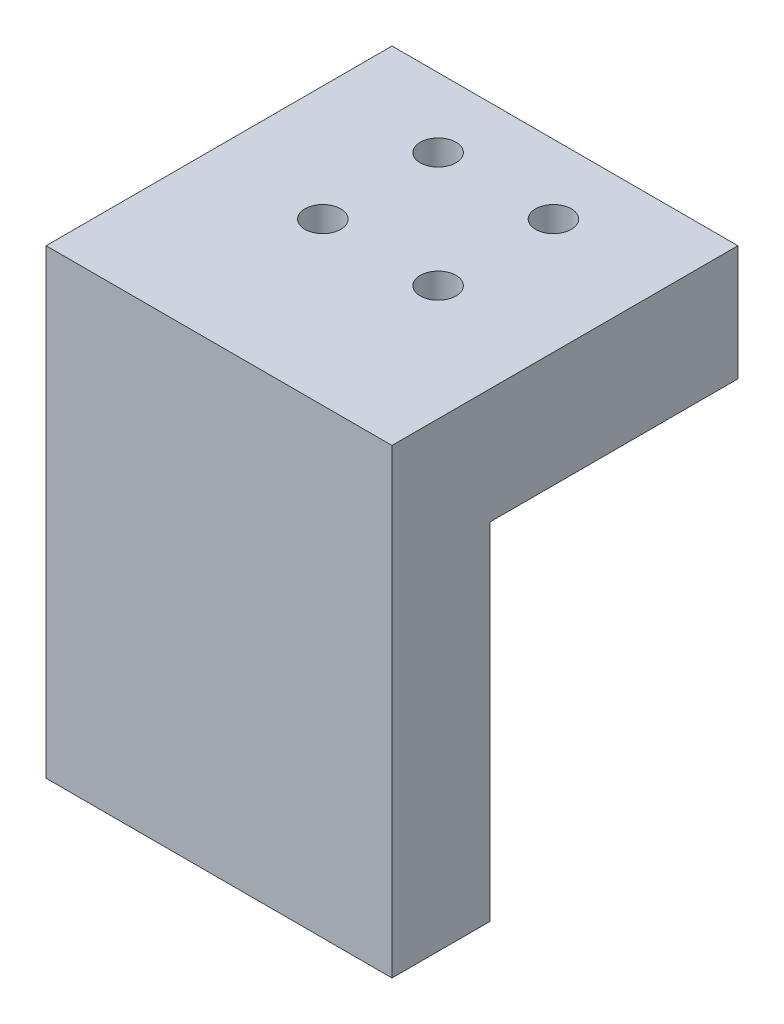
ISO-10303-21;
HEADER;
FILE_DESCRIPTION(('STEP AP214'),'2;1');
FILE_NAME('part.step','',(''),(''),'','','');
FILE_SCHEMA(('AUTOMOTIVE_DESIGN { 1 0 10303 214 1 1 1 1 }'));
ENDSEC;
DATA;
#1=APPLICATION_CONTEXT('core data for automotive mechanical design processes');
#2=APPLICATION_PROTOCOL_DEFINITION('international standard','automotive_design',2000,#1);
#3=PRODUCT_CONTEXT('',#1,'mechanical');
#4=PRODUCT('Part','Part','',(#3));
#5=PRODUCT_RELATED_PRODUCT_CATEGORY('part','',(#4));
#6=PRODUCT_DEFINITION_FORMATION('','',#4);
#7=PRODUCT_DEFINITION_CONTEXT('part definition',#1,'design');
#8=PRODUCT_DEFINITION('design','',#6,#7);
#9=PRODUCT_DEFINITION_SHAPE('','',#8);
#10=(LENGTH_UNIT() NAMED_UNIT(*) SI_UNIT(.MILLI.,.METRE.));
#11=(NAMED_UNIT(*) PLANE_ANGLE_UNIT() SI_UNIT($,.RADIAN.));
#12=(NAMED_UNIT(*) SI_UNIT($,.STERADIAN.) SOLID_ANGLE_UNIT());
#13=UNCERTAINTY_MEASURE_WITH_UNIT(LENGTH_MEASURE(1.E-05),#10,'distance_accuracy_value','');
#14=(GEOMETRIC_REPRESENTATION_CONTEXT(3) GLOBAL_UNCERTAINTY_ASSIGNED_CONTEXT((#13)) GLOBAL_UNIT_ASSIGNED_CONTEXT((#10,
#11,#12)) REPRESENTATION_CONTEXT('',''));
#15=CARTESIAN_POINT('',(0.,0.,0.));
#16=DIRECTION('',(0.,0.,1.));
#17=DIRECTION('',(1.,0.,0.));
#18=AXIS2_PLACEMENT_3D('',#15,#16,#17);
#19=CARTESIAN_POINT('',(5.,30.,1.));
#20=DIRECTION('',(0.,-1.,0.));
#21=DIRECTION('',(0.,0.,-1.));
#22=AXIS2_PLACEMENT_3D('',#19,#20,#21);
#23=CYLINDRICAL_SURFACE('',#22,1.55);
#24=CARTESIAN_POINT('',(5.,10.,1.));
#25=DIRECTION('',(0.,-1.,0.));
#26=DIRECTION('',(0.,0.,-1.));
#27=AXIS2_PLACEMENT_3D('',#24,#25,#26);
#28=CIRCLE('',#27,1.55);
#29=CARTESIAN_POINT('',(5.,10.,-0.55));
#30=VERTEX_POINT('',#29);
#31=EDGE_CURVE('E294',#30,#30,#28,.T.);
#32=ORIENTED_EDGE('',*,*,#31,.F.);
#33=EDGE_LOOP('',(#32));
#34=FACE_BOUND('',#33,.T.);
#35=CARTESIAN_POINT('',(5.,3.,1.));
#36=DIRECTION('',(0.,-1.,0.));
#37=DIRECTION('',(0.,0.,-1.));
#38=AXIS2_PLACEMENT_3D('',#35,#36,#37);
#39=CIRCLE('',#38,1.55);
#40=CARTESIAN_POINT('',(5.,3.,-0.55));
#41=VERTEX_POINT('',#40);
#42=EDGE_CURVE('E260',#41,#41,#39,.F.);
#43=ORIENTED_EDGE('',*,*,#42,.F.);
#44=EDGE_LOOP('',(#43));
#45=FACE_BOUND('',#44,.T.);
#46=ADVANCED_FACE('F47',(#34,#45),#23,.F.);
#47=CARTESIAN_POINT('',(-5.,30.,-9.));
#48=DIRECTION('',(0.,-1.,0.));
#49=DIRECTION('',(0.,0.,-1.));
#50=AXIS2_PLACEMENT_3D('',#47,#48,#49);
#51=CYLINDRICAL_SURFACE('',#50,1.55);
#52=CARTESIAN_POINT('',(-5.,10.,-9.));
#53=DIRECTION('',(0.,-1.,0.));
#54=DIRECTION('',(0.,0.,-1.));
#55=AXIS2_PLACEMENT_3D('',#52,#53,#54);
#56=CIRCLE('',#55,1.55);
#57=CARTESIAN_POINT('',(-5.,10.,-10.55));
#58=VERTEX_POINT('',#57);
#59=EDGE_CURVE('E298',#58,#58,#56,.T.);
#60=ORIENTED_EDGE('',*,*,#59,.F.);
#61=EDGE_LOOP('',(#60));
#62=FACE_BOUND('',#61,.T.);
#63=CARTESIAN_POINT('',(-5.,3.,-9.));
#64=DIRECTION('',(0.,-1.,0.));
#65=DIRECTION('',(0.,0.,-1.));
#66=AXIS2_PLACEMENT_3D('',#63,#64,#65);
#67=CIRCLE('',#66,1.55);
#68=CARTESIAN_POINT('',(-5.,3.,-10.55));
#69=VERTEX_POINT('',#68);
#70=EDGE_CURVE('E271',#69,#69,#67,.F.);
#71=ORIENTED_EDGE('',*,*,#70,.F.);
#72=EDGE_LOOP('',(#71));
#73=FACE_BOUND('',#72,.T.);
#74=ADVANCED_FACE('F194',(#62,#73),#51,.F.);
#75=CARTESIAN_POINT('',(-5.,30.,1.));
#76=DIRECTION('',(0.,-1.,0.));
#77=DIRECTION('',(0.,0.,-1.));
#78=AXIS2_PLACEMENT_3D('',#75,#76,#77);
#79=CYLINDRICAL_SURFACE('',#78,1.55);
#80=CARTESIAN_POINT('',(-5.,10.,1.));
#81=DIRECTION('',(0.,-1.,0.));
#82=DIRECTION('',(0.,0.,-1.));
#83=AXIS2_PLACEMENT_3D('',#80,#81,#82);
#84=CIRCLE('',#83,1.55);
#85=CARTESIAN_POINT('',(-5.,10.,-0.55));
#86=VERTEX_POINT('',#85);
#87=EDGE_CURVE('E301',#86,#86,#84,.T.);
#88=ORIENTED_EDGE('',*,*,#87,.F.);
#89=EDGE_LOOP('',(#88));
#90=FACE_BOUND('',#89,.T.);
#91=CARTESIAN_POINT('',(-5.,3.,1.));
#92=DIRECTION('',(0.,-1.,0.));
#93=DIRECTION('',(0.,0.,-1.));
#94=AXIS2_PLACEMENT_3D('',#91,#92,#93);
#95=CIRCLE('',#94,1.55);
#96=CARTESIAN_POINT('',(-5.,3.,-0.55));
#97=VERTEX_POINT('',#96);
#98=EDGE_CURVE('E51',#97,#97,#95,.F.);
#99=ORIENTED_EDGE('',*,*,#98,.F.);
#100=EDGE_LOOP('',(#99));
#101=FACE_BOUND('',#100,.T.);
#102=ADVANCED_FACE('F200',(#90,#101),#79,.F.);
#103=CARTESIAN_POINT('',(5.,30.,-9.));
#104=DIRECTION('',(0.,-1.,0.));
#105=DIRECTION('',(0.,0.,-1.));
#106=AXIS2_PLACEMENT_3D('',#103,#104,#105);
#107=CYLINDRICAL_SURFACE('',#106,1.55);
#108=CARTESIAN_POINT('',(5.,10.,-9.));
#109=DIRECTION('',(0.,-1.,0.));
#110=DIRECTION('',(0.,0.,-1.));
#111=AXIS2_PLACEMENT_3D('',#108,#109,#110);
#112=CIRCLE('',#111,1.55);
#113=CARTESIAN_POINT('',(5.,10.,-10.55));
#114=VERTEX_POINT('',#113);
#115=EDGE_CURVE('E137',#114,#114,#112,.T.);
#116=ORIENTED_EDGE('',*,*,#115,.F.);
#117=EDGE_LOOP('',(#116));
#118=FACE_BOUND('',#117,.T.);
#119=CARTESIAN_POINT('',(5.,3.,-9.));
#120=DIRECTION('',(0.,-1.,0.));
#121=DIRECTION('',(0.,0.,-1.));
#122=AXIS2_PLACEMENT_3D('',#119,#120,#121);
#123=CIRCLE('',#122,1.55);
#124=CARTESIAN_POINT('',(5.,3.,-10.55));
#125=VERTEX_POINT('',#124);
#126=EDGE_CURVE('E255',#125,#125,#123,.F.);
#127=ORIENTED_EDGE('',*,*,#126,.F.);
#128=EDGE_LOOP('',(#127));
#129=FACE_BOUND('',#128,.T.);
#130=ADVANCED_FACE('F208',(#118,#129),#107,.F.);
#131=CARTESIAN_POINT('',(15.,10.,15.));
#132=DIRECTION('',(-1.,0.,0.));
#133=DIRECTION('',(0.,0.,1.));
#134=AXIS2_PLACEMENT_3D('',#131,#132,#133);
#135=PLANE('',#134);
#136=DIRECTION('',(0.,-1.,0.));
#137=VECTOR('',#136,1.);
#138=CARTESIAN_POINT('',(15.,10.,15.));
#139=LINE('',#138,#137);
#140=CARTESIAN_POINT('',(15.,10.,15.));
#141=VERTEX_POINT('',#140);
#142=CARTESIAN_POINT('',(15.,-30.,15.));
#143=VERTEX_POINT('',#142);
#144=EDGE_CURVE('E110',#141,#143,#139,.T.);
#145=ORIENTED_EDGE('',*,*,#144,.T.);
#146=DIRECTION('',(0.,0.,1.));
#147=VECTOR('',#146,1.);
#148=CARTESIAN_POINT('',(15.,-30.,0.));
#149=LINE('',#148,#147);
#150=CARTESIAN_POINT('',(15.,-30.,6.5));
#151=VERTEX_POINT('',#150);
#152=EDGE_CURVE('E114',#151,#143,#149,.T.);
#153=ORIENTED_EDGE('',*,*,#152,.F.);
#154=DIRECTION('',(0.,1.,0.));
#155=VECTOR('',#154,1.);
#156=CARTESIAN_POINT('',(15.,-30.,6.5));
#157=LINE('',#156,#155);
#158=CARTESIAN_POINT('',(15.,0.,6.5));
#159=VERTEX_POINT('',#158);
#160=EDGE_CURVE('E145',#151,#159,#157,.T.);
#161=ORIENTED_EDGE('',*,*,#160,.T.);
#162=DIRECTION('',(0.,0.,-1.));
#163=VECTOR('',#162,1.);
#164=CARTESIAN_POINT('',(15.,0.,15.));
#165=LINE('',#164,#163);
#166=CARTESIAN_POINT('',(15.,0.,-15.));
#167=VERTEX_POINT('',#166);
#168=EDGE_CURVE('E153',#159,#167,#165,.T.);
#169=ORIENTED_EDGE('',*,*,#168,.T.);
#170=DIRECTION('',(0.,-1.,0.));
#171=VECTOR('',#170,1.);
#172=CARTESIAN_POINT('',(15.,10.,-15.));
#173=LINE('',#172,#171);
#174=CARTESIAN_POINT('',(15.,10.,-15.));
#175=VERTEX_POINT('',#174);
#176=EDGE_CURVE('E12',#175,#167,#173,.T.);
#177=ORIENTED_EDGE('',*,*,#176,.F.);
#178=DIRECTION('',(0.,0.,-1.));
#179=VECTOR('',#178,1.);
#180=CARTESIAN_POINT('',(15.,10.,15.));
#181=LINE('',#180,#179);
#182=EDGE_CURVE('E116',#141,#175,#181,.T.);
#183=ORIENTED_EDGE('',*,*,#182,.F.);
#184=EDGE_LOOP('',(#145,#153,#161,#169,#177,#183));
#185=FACE_BOUND('',#184,.T.);
#186=ADVANCED_FACE('F49',(#185),#135,.F.);
#187=CARTESIAN_POINT('',(-15.,10.,-15.));
#188=DIRECTION('',(0.,0.,1.));
#189=DIRECTION('',(1.,0.,0.));
#190=AXIS2_PLACEMENT_3D('',#187,#188,#189);
#191=PLANE('',#190);
#192=DIRECTION('',(-1.,0.,0.));
#193=VECTOR('',#192,1.);
#194=CARTESIAN_POINT('',(-15.,0.,-15.));
#195=LINE('',#194,#193);
#196=CARTESIAN_POINT('',(-15.,0.,-15.));
#197=VERTEX_POINT('',#196);
#198=EDGE_CURVE('E88',#167,#197,#195,.T.);
#199=ORIENTED_EDGE('',*,*,#198,.T.);
#200=DIRECTION('',(0.,-1.,0.));
#201=VECTOR('',#200,1.);
#202=CARTESIAN_POINT('',(-15.,10.,-15.));
#203=LINE('',#202,#201);
#204=CARTESIAN_POINT('',(-15.,10.,-15.));
#205=VERTEX_POINT('',#204);
#206=EDGE_CURVE('E57',#205,#197,#203,.T.);
#207=ORIENTED_EDGE('',*,*,#206,.F.);
#208=DIRECTION('',(-1.,0.,0.));
#209=VECTOR('',#208,1.);
#210=CARTESIAN_POINT('',(-15.,10.,-15.));
#211=LINE('',#210,#209);
#212=EDGE_CURVE('E93',#175,#205,#211,.T.);
#213=ORIENTED_EDGE('',*,*,#212,.F.);
#214=ORIENTED_EDGE('',*,*,#176,.T.);
#215=EDGE_LOOP('',(#199,#207,#213,#214));
#216=FACE_BOUND('',#215,.T.);
#217=ADVANCED_FACE('F178',(#216),#191,.F.);
#218=CARTESIAN_POINT('',(-15.,10.,15.));
#219=DIRECTION('',(1.,0.,0.));
#220=DIRECTION('',(0.,0.,-1.));
#221=AXIS2_PLACEMENT_3D('',#218,#219,#220);
#222=PLANE('',#221);
#223=DIRECTION('',(0.,0.,1.));
#224=VECTOR('',#223,1.);
#225=CARTESIAN_POINT('',(-15.,0.,15.));
#226=LINE('',#225,#224);
#227=CARTESIAN_POINT('',(-15.,0.,6.5));
#228=VERTEX_POINT('',#227);
#229=EDGE_CURVE('E156',#197,#228,#226,.T.);
#230=ORIENTED_EDGE('',*,*,#229,.T.);
#231=DIRECTION('',(0.,1.,0.));
#232=VECTOR('',#231,1.);
#233=CARTESIAN_POINT('',(-15.,-30.,6.5));
#234=LINE('',#233,#232);
#235=CARTESIAN_POINT('',(-15.,-30.,6.5));
#236=VERTEX_POINT('',#235);
#237=EDGE_CURVE('E149',#236,#228,#234,.T.);
#238=ORIENTED_EDGE('',*,*,#237,.F.);
#239=DIRECTION('',(0.,0.,-1.));
#240=VECTOR('',#239,1.);
#241=CARTESIAN_POINT('',(-15.,-30.,0.));
#242=LINE('',#241,#240);
#243=CARTESIAN_POINT('',(-15.,-30.,15.));
#244=VERTEX_POINT('',#243);
#245=EDGE_CURVE('E128',#244,#236,#242,.T.);
#246=ORIENTED_EDGE('',*,*,#245,.F.);
#247=DIRECTION('',(0.,-1.,0.));
#248=VECTOR('',#247,1.);
#249=CARTESIAN_POINT('',(-15.,10.,15.));
#250=LINE('',#249,#248);
#251=CARTESIAN_POINT('',(-15.,10.,15.));
#252=VERTEX_POINT('',#251);
#253=EDGE_CURVE('E119',#252,#244,#250,.T.);
#254=ORIENTED_EDGE('',*,*,#253,.F.);
#255=DIRECTION('',(0.,0.,1.));
#256=VECTOR('',#255,1.);
#257=CARTESIAN_POINT('',(-15.,10.,15.));
#258=LINE('',#257,#256);
#259=EDGE_CURVE('E159',#205,#252,#258,.T.);
#260=ORIENTED_EDGE('',*,*,#259,.F.);
#261=ORIENTED_EDGE('',*,*,#206,.T.);
#262=EDGE_LOOP('',(#230,#238,#246,#254,#260,#261));
#263=FACE_BOUND('',#262,.T.);
#264=ADVANCED_FACE('F175',(#263),#222,.F.);
#265=CARTESIAN_POINT('',(-15.,10.,15.));
#266=DIRECTION('',(0.,0.,-1.));
#267=DIRECTION('',(-1.,0.,0.));
#268=AXIS2_PLACEMENT_3D('',#265,#266,#267);
#269=PLANE('',#268);
#270=ORIENTED_EDGE('',*,*,#253,.T.);
#271=DIRECTION('',(-1.,0.,0.));
#272=VECTOR('',#271,1.);
#273=CARTESIAN_POINT('',(0.,-30.,15.));
#274=LINE('',#273,#272);
#275=EDGE_CURVE('E122',#143,#244,#274,.T.);
#276=ORIENTED_EDGE('',*,*,#275,.F.);
#277=ORIENTED_EDGE('',*,*,#144,.F.);
#278=DIRECTION('',(1.,0.,0.));
#279=VECTOR('',#278,1.);
#280=CARTESIAN_POINT('',(-15.,10.,15.));
#281=LINE('',#280,#279);
#282=EDGE_CURVE('E73',#252,#141,#281,.T.);
#283=ORIENTED_EDGE('',*,*,#282,.F.);
#284=EDGE_LOOP('',(#270,#276,#277,#283));
#285=FACE_BOUND('',#284,.T.);
#286=ADVANCED_FACE('F123',(#285),#269,.F.);
#287=CARTESIAN_POINT('',(0.,10.,0.));
#288=DIRECTION('',(0.,-1.,0.));
#289=DIRECTION('',(0.,0.,-1.));
#290=AXIS2_PLACEMENT_3D('',#287,#288,#289);
#291=PLANE('',#290);
#292=ORIENTED_EDGE('',*,*,#115,.T.);
#293=EDGE_LOOP('',(#292));
#294=FACE_BOUND('',#293,.T.);
#295=ORIENTED_EDGE('',*,*,#87,.T.);
#296=EDGE_LOOP('',(#295));
#297=FACE_BOUND('',#296,.T.);
#298=ORIENTED_EDGE('',*,*,#59,.T.);
#299=EDGE_LOOP('',(#298));
#300=FACE_BOUND('',#299,.T.);
#301=ORIENTED_EDGE('',*,*,#31,.T.);
#302=EDGE_LOOP('',(#301));
#303=FACE_BOUND('',#302,.T.);
#304=ORIENTED_EDGE('',*,*,#182,.T.);
#305=ORIENTED_EDGE('',*,*,#212,.T.);
#306=ORIENTED_EDGE('',*,*,#259,.T.);
#307=ORIENTED_EDGE('',*,*,#282,.T.);
#308=EDGE_LOOP('',(#304,#305,#306,#307));
#309=FACE_BOUND('',#308,.T.);
#310=ADVANCED_FACE('F189',(#294,#297,#300,#303,#309),#291,.F.);
#311=CARTESIAN_POINT('',(0.,0.,0.));
#312=DIRECTION('',(0.,-1.,0.));
#313=DIRECTION('',(0.,0.,-1.));
#314=AXIS2_PLACEMENT_3D('',#311,#312,#313);
#315=PLANE('',#314);
#316=CARTESIAN_POINT('',(-5.,0.,1.));
#317=DIRECTION('',(0.,-1.,0.));
#318=DIRECTION('',(0.,0.,-1.));
#319=AXIS2_PLACEMENT_3D('',#316,#317,#318);
#320=CIRCLE('',#319,3.5);
#321=CARTESIAN_POINT('',(-5.,0.,-2.5));
#322=VERTEX_POINT('',#321);
#323=EDGE_CURVE('E276',#322,#322,#320,.T.);
#324=ORIENTED_EDGE('',*,*,#323,.F.);
#325=EDGE_LOOP('',(#324));
#326=FACE_BOUND('',#325,.T.);
#327=CARTESIAN_POINT('',(-5.,0.,-9.));
#328=DIRECTION('',(0.,-1.,0.));
#329=DIRECTION('',(0.,0.,-1.));
#330=AXIS2_PLACEMENT_3D('',#327,#328,#329);
#331=CIRCLE('',#330,3.5);
#332=CARTESIAN_POINT('',(-5.,0.,-12.5));
#333=VERTEX_POINT('',#332);
#334=EDGE_CURVE('E266',#333,#333,#331,.T.);
#335=ORIENTED_EDGE('',*,*,#334,.F.);
#336=EDGE_LOOP('',(#335));
#337=FACE_BOUND('',#336,.T.);
#338=CARTESIAN_POINT('',(5.,0.,-9.));
#339=DIRECTION('',(0.,-1.,0.));
#340=DIRECTION('',(0.,0.,-1.));
#341=AXIS2_PLACEMENT_3D('',#338,#339,#340);
#342=CIRCLE('',#341,3.5);
#343=CARTESIAN_POINT('',(5.,0.,-12.5));
#344=VERTEX_POINT('',#343);
#345=EDGE_CURVE('E251',#344,#344,#342,.T.);
#346=ORIENTED_EDGE('',*,*,#345,.F.);
#347=EDGE_LOOP('',(#346));
#348=FACE_BOUND('',#347,.T.);
#349=CARTESIAN_POINT('',(5.,0.,1.));
#350=DIRECTION('',(0.,-1.,0.));
#351=DIRECTION('',(0.,0.,-1.));
#352=AXIS2_PLACEMENT_3D('',#349,#350,#351);
#353=CIRCLE('',#352,3.5);
#354=CARTESIAN_POINT('',(5.,0.,-2.5));
#355=VERTEX_POINT('',#354);
#356=EDGE_CURVE('E254',#355,#355,#353,.T.);
#357=ORIENTED_EDGE('',*,*,#356,.F.);
#358=EDGE_LOOP('',(#357));
#359=FACE_BOUND('',#358,.T.);
#360=DIRECTION('',(1.,0.,0.));
#361=VECTOR('',#360,1.);
#362=CARTESIAN_POINT('',(0.,0.,6.5));
#363=LINE('',#362,#361);
#364=EDGE_CURVE('E64',#228,#159,#363,.T.);
#365=ORIENTED_EDGE('',*,*,#364,.F.);
#366=ORIENTED_EDGE('',*,*,#229,.F.);
#367=ORIENTED_EDGE('',*,*,#198,.F.);
#368=ORIENTED_EDGE('',*,*,#168,.F.);
#369=EDGE_LOOP('',(#365,#366,#367,#368));
#370=FACE_BOUND('',#369,.T.);
#371=ADVANCED_FACE('F177',(#326,#337,#348,#359,#370),#315,.T.);
#372=CARTESIAN_POINT('',(0.,-30.,6.5));
#373=DIRECTION('',(0.,0.,1.));
#374=DIRECTION('',(1.,0.,0.));
#375=AXIS2_PLACEMENT_3D('',#372,#373,#374);
#376=PLANE('',#375);
#377=ORIENTED_EDGE('',*,*,#364,.T.);
#378=ORIENTED_EDGE('',*,*,#160,.F.);
#379=DIRECTION('',(1.,0.,0.));
#380=VECTOR('',#379,1.);
#381=CARTESIAN_POINT('',(0.,-30.,6.5));
#382=LINE('',#381,#380);
#383=EDGE_CURVE('E132',#236,#151,#382,.T.);
#384=ORIENTED_EDGE('',*,*,#383,.F.);
#385=ORIENTED_EDGE('',*,*,#237,.T.);
#386=EDGE_LOOP('',(#377,#378,#384,#385));
#387=FACE_BOUND('',#386,.T.);
#388=ADVANCED_FACE('F180',(#387),#376,.F.);
#389=CARTESIAN_POINT('',(0.,-30.,0.));
#390=DIRECTION('',(0.,-1.,0.));
#391=DIRECTION('',(0.,0.,-1.));
#392=AXIS2_PLACEMENT_3D('',#389,#390,#391);
#393=PLANE('',#392);
#394=ORIENTED_EDGE('',*,*,#152,.T.);
#395=ORIENTED_EDGE('',*,*,#275,.T.);
#396=ORIENTED_EDGE('',*,*,#245,.T.);
#397=ORIENTED_EDGE('',*,*,#383,.T.);
#398=EDGE_LOOP('',(#394,#395,#396,#397));
#399=FACE_BOUND('',#398,.T.);
#400=ADVANCED_FACE('F130',(#399),#393,.T.);
#401=CARTESIAN_POINT('',(5.,3.,-9.));
#402=DIRECTION('',(0.,-1.,0.));
#403=DIRECTION('',(0.,0.,-1.));
#404=AXIS2_PLACEMENT_3D('',#401,#402,#403);
#405=CYLINDRICAL_SURFACE('',#404,3.5);
#406=CARTESIAN_POINT('',(5.,3.,-9.));
#407=DIRECTION('',(0.,-1.,0.));
#408=DIRECTION('',(0.,0.,-1.));
#409=AXIS2_PLACEMENT_3D('',#406,#407,#408);
#410=CIRCLE('',#409,3.5);
#411=CARTESIAN_POINT('',(5.,3.,-12.5));
#412=VERTEX_POINT('',#411);
#413=EDGE_CURVE('E248',#412,#412,#410,.T.);
#414=ORIENTED_EDGE('',*,*,#413,.F.);
#415=EDGE_LOOP('',(#414));
#416=FACE_BOUND('',#415,.T.);
#417=ORIENTED_EDGE('',*,*,#345,.T.);
#418=EDGE_LOOP('',(#417));
#419=FACE_BOUND('',#418,.T.);
#420=ADVANCED_FACE('F187',(#416,#419),#405,.F.);
#421=CARTESIAN_POINT('',(0.,3.,0.));
#422=DIRECTION('',(0.,-1.,0.));
#423=DIRECTION('',(0.,0.,-1.));
#424=AXIS2_PLACEMENT_3D('',#421,#422,#423);
#425=PLANE('',#424);
#426=ORIENTED_EDGE('',*,*,#126,.T.);
#427=EDGE_LOOP('',(#426));
#428=FACE_BOUND('',#427,.T.);
#429=ORIENTED_EDGE('',*,*,#413,.T.);
#430=EDGE_LOOP('',(#429));
#431=FACE_BOUND('',#430,.T.);
#432=ADVANCED_FACE('F226',(#428,#431),#425,.T.);
#433=CARTESIAN_POINT('',(-5.,3.,1.));
#434=DIRECTION('',(0.,-1.,0.));
#435=DIRECTION('',(0.,0.,-1.));
#436=AXIS2_PLACEMENT_3D('',#433,#434,#435);
#437=PLANE('',#436);
#438=CARTESIAN_POINT('',(-5.,3.,1.));
#439=DIRECTION('',(0.,-1.,0.));
#440=DIRECTION('',(0.,0.,-1.));
#441=AXIS2_PLACEMENT_3D('',#438,#439,#440);
#442=CIRCLE('',#441,3.5);
#443=CARTESIAN_POINT('',(-5.,3.,-2.5));
#444=VERTEX_POINT('',#443);
#445=EDGE_CURVE('E283',#444,#444,#442,.T.);
#446=ORIENTED_EDGE('',*,*,#445,.T.);
#447=EDGE_LOOP('',(#446));
#448=FACE_BOUND('',#447,.T.);
#449=ORIENTED_EDGE('',*,*,#98,.T.);
#450=EDGE_LOOP('',(#449));
#451=FACE_BOUND('',#450,.T.);
#452=ADVANCED_FACE('F222',(#448,#451),#437,.T.);
#453=CARTESIAN_POINT('',(-5.,3.,1.));
#454=DIRECTION('',(0.,-1.,0.));
#455=DIRECTION('',(0.,0.,-1.));
#456=AXIS2_PLACEMENT_3D('',#453,#454,#455);
#457=CYLINDRICAL_SURFACE('',#456,3.5);
#458=ORIENTED_EDGE('',*,*,#445,.F.);
#459=EDGE_LOOP('',(#458));
#460=FACE_BOUND('',#459,.T.);
#461=ORIENTED_EDGE('',*,*,#323,.T.);
#462=EDGE_LOOP('',(#461));
#463=FACE_BOUND('',#462,.T.);
#464=ADVANCED_FACE('F225',(#460,#463),#457,.F.);
#465=CARTESIAN_POINT('',(-5.,3.,-9.));
#466=DIRECTION('',(0.,-1.,0.));
#467=DIRECTION('',(0.,0.,-1.));
#468=AXIS2_PLACEMENT_3D('',#465,#466,#467);
#469=CYLINDRICAL_SURFACE('',#468,3.5);
#470=CARTESIAN_POINT('',(-5.,3.,-9.));
#471=DIRECTION('',(0.,-1.,0.));
#472=DIRECTION('',(0.,0.,-1.));
#473=AXIS2_PLACEMENT_3D('',#470,#471,#472);
#474=CIRCLE('',#473,3.5);
#475=CARTESIAN_POINT('',(-5.,3.,-12.5));
#476=VERTEX_POINT('',#475);
#477=EDGE_CURVE('E272',#476,#476,#474,.T.);
#478=ORIENTED_EDGE('',*,*,#477,.F.);
#479=EDGE_LOOP('',(#478));
#480=FACE_BOUND('',#479,.T.);
#481=ORIENTED_EDGE('',*,*,#334,.T.);
#482=EDGE_LOOP('',(#481));
#483=FACE_BOUND('',#482,.T.);
#484=ADVANCED_FACE('F230',(#480,#483),#469,.F.);
#485=CARTESIAN_POINT('',(0.,3.,0.));
#486=DIRECTION('',(0.,-1.,0.));
#487=DIRECTION('',(0.,0.,-1.));
#488=AXIS2_PLACEMENT_3D('',#485,#486,#487);
#489=PLANE('',#488);
#490=ORIENTED_EDGE('',*,*,#70,.T.);
#491=EDGE_LOOP('',(#490));
#492=FACE_BOUND('',#491,.T.);
#493=ORIENTED_EDGE('',*,*,#477,.T.);
#494=EDGE_LOOP('',(#493));
#495=FACE_BOUND('',#494,.T.);
#496=ADVANCED_FACE('F217',(#492,#495),#489,.T.);
#497=CARTESIAN_POINT('',(5.,3.,1.));
#498=DIRECTION('',(0.,-1.,0.));
#499=DIRECTION('',(0.,0.,-1.));
#500=AXIS2_PLACEMENT_3D('',#497,#498,#499);
#501=CYLINDRICAL_SURFACE('',#500,3.5);
#502=CARTESIAN_POINT('',(5.,3.,1.));
#503=DIRECTION('',(0.,-1.,0.));
#504=DIRECTION('',(0.,0.,-1.));
#505=AXIS2_PLACEMENT_3D('',#502,#503,#504);
#506=CIRCLE('',#505,3.5);
#507=CARTESIAN_POINT('',(5.,3.,-2.5));
#508=VERTEX_POINT('',#507);
#509=EDGE_CURVE('E290',#508,#508,#506,.T.);
#510=ORIENTED_EDGE('',*,*,#509,.F.);
#511=EDGE_LOOP('',(#510));
#512=FACE_BOUND('',#511,.T.);
#513=ORIENTED_EDGE('',*,*,#356,.T.);
#514=EDGE_LOOP('',(#513));
#515=FACE_BOUND('',#514,.T.);
#516=ADVANCED_FACE('F213',(#512,#515),#501,.F.);
#517=CARTESIAN_POINT('',(0.,3.,0.));
#518=DIRECTION('',(0.,-1.,0.));
#519=DIRECTION('',(0.,0.,-1.));
#520=AXIS2_PLACEMENT_3D('',#517,#518,#519);
#521=PLANE('',#520);
#522=ORIENTED_EDGE('',*,*,#42,.T.);
#523=EDGE_LOOP('',(#522));
#524=FACE_BOUND('',#523,.T.);
#525=ORIENTED_EDGE('',*,*,#509,.T.);
#526=EDGE_LOOP('',(#525));
#527=FACE_BOUND('',#526,.T.);
#528=ADVANCED_FACE('F216',(#524,#527),#521,.T.);
#529=CLOSED_SHELL('',(#46,#74,#102,#130,#186,#217,#264,#286,#310,#371,#388,#400,#420,#432,#452,
#464,#484,#496,#516,#528));
#530=MANIFOLD_SOLID_BREP('B2',#529);
#531=ADVANCED_BREP_SHAPE_REPRESENTATION('',(#18,#530),#14);
#532=SHAPE_DEFINITION_REPRESENTATION(#9,#531);
ENDSEC;
END-ISO-10303-21;
